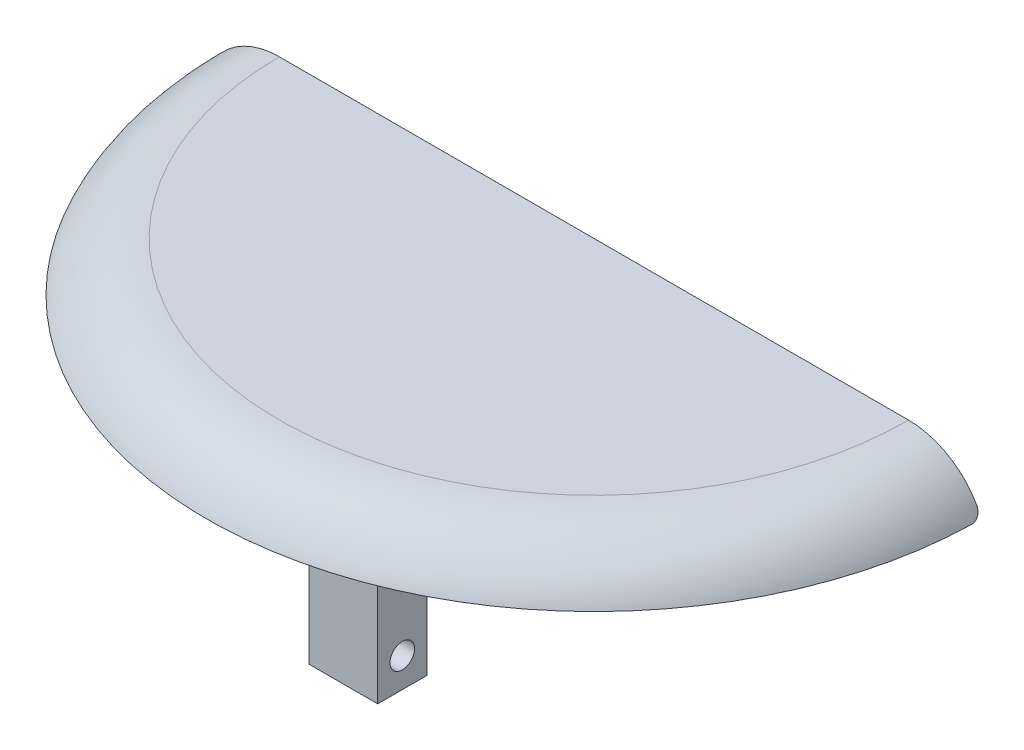
ISO-10303-21;
HEADER;
FILE_DESCRIPTION(('STEP AP214'),'2;1');
FILE_NAME('part.step','',(''),(''),'','','');
FILE_SCHEMA(('AUTOMOTIVE_DESIGN { 1 0 10303 214 1 1 1 1 }'));
ENDSEC;
DATA;
#1=APPLICATION_CONTEXT('core data for automotive mechanical design processes');
#2=APPLICATION_PROTOCOL_DEFINITION('international standard','automotive_design',2000,#1);
#3=PRODUCT_CONTEXT('',#1,'mechanical');
#4=PRODUCT('Part','Part','',(#3));
#5=PRODUCT_RELATED_PRODUCT_CATEGORY('part','',(#4));
#6=PRODUCT_DEFINITION_FORMATION('','',#4);
#7=PRODUCT_DEFINITION_CONTEXT('part definition',#1,'design');
#8=PRODUCT_DEFINITION('design','',#6,#7);
#9=PRODUCT_DEFINITION_SHAPE('','',#8);
#10=(LENGTH_UNIT() NAMED_UNIT(*) SI_UNIT(.MILLI.,.METRE.));
#11=(NAMED_UNIT(*) PLANE_ANGLE_UNIT() SI_UNIT($,.RADIAN.));
#12=(NAMED_UNIT(*) SI_UNIT($,.STERADIAN.) SOLID_ANGLE_UNIT());
#13=UNCERTAINTY_MEASURE_WITH_UNIT(LENGTH_MEASURE(1.E-05),#10,'distance_accuracy_value','');
#14=(GEOMETRIC_REPRESENTATION_CONTEXT(3) GLOBAL_UNCERTAINTY_ASSIGNED_CONTEXT((#13)) GLOBAL_UNIT_ASSIGNED_CONTEXT((#10,
#11,#12)) REPRESENTATION_CONTEXT('',''));
#15=CARTESIAN_POINT('',(0.,0.,0.));
#16=DIRECTION('',(0.,0.,1.));
#17=DIRECTION('',(1.,0.,0.));
#18=AXIS2_PLACEMENT_3D('',#15,#16,#17);
#19=CARTESIAN_POINT('',(0.,58.4278760968653,0.));
#20=DIRECTION('',(0.,1.,0.));
#21=DIRECTION('',(0.,0.,1.));
#22=AXIS2_PLACEMENT_3D('',#19,#20,#21);
#23=PLANE('',#22);
#24=DIRECTION('',(1.,0.,0.));
#25=VECTOR('',#24,1.);
#26=CARTESIAN_POINT('',(3.00000000000001,58.4278760968653,32.));
#27=LINE('',#26,#25);
#28=CARTESIAN_POINT('',(3.00000000000001,58.4278760968653,32.));
#29=VERTEX_POINT('',#28);
#30=CARTESIAN_POINT('',(10.,58.4278760968653,32.));
#31=VERTEX_POINT('',#30);
#32=EDGE_CURVE('E129',#29,#31,#27,.T.);
#33=ORIENTED_EDGE('',*,*,#32,.T.);
#34=DIRECTION('',(0.,0.,-1.));
#35=VECTOR('',#34,1.);
#36=CARTESIAN_POINT('',(10.,58.4278760968653,27.));
#37=LINE('',#36,#35);
#38=CARTESIAN_POINT('',(10.,58.4278760968653,27.));
#39=VERTEX_POINT('',#38);
#40=EDGE_CURVE('E142',#31,#39,#37,.T.);
#41=ORIENTED_EDGE('',*,*,#40,.T.);
#42=DIRECTION('',(-1.,0.,0.));
#43=VECTOR('',#42,1.);
#44=CARTESIAN_POINT('',(3.00000000000001,58.4278760968653,27.));
#45=LINE('',#44,#43);
#46=CARTESIAN_POINT('',(3.00000000000001,58.4278760968653,27.));
#47=VERTEX_POINT('',#46);
#48=EDGE_CURVE('E106',#39,#47,#45,.T.);
#49=ORIENTED_EDGE('',*,*,#48,.T.);
#50=DIRECTION('',(0.,0.,1.));
#51=VECTOR('',#50,1.);
#52=CARTESIAN_POINT('',(3.00000000000001,58.4278760968653,27.));
#53=LINE('',#52,#51);
#54=EDGE_CURVE('E133',#47,#29,#53,.T.);
#55=ORIENTED_EDGE('',*,*,#54,.T.);
#56=EDGE_LOOP('',(#33,#41,#49,#55));
#57=FACE_BOUND('',#56,.T.);
#58=CARTESIAN_POINT('',(0.,58.4278760968653,0.));
#59=DIRECTION('',(0.,1.,0.));
#60=DIRECTION('',(0.,0.,1.));
#61=AXIS2_PLACEMENT_3D('',#58,#59,#60);
#62=CIRCLE('',#61,39.4161984870957);
#63=CARTESIAN_POINT('',(39.4035113051378,58.4278760968653,0.999999999999999));
#64=VERTEX_POINT('',#63);
#65=CARTESIAN_POINT('',(-39.4035113051378,58.4278760968653,1.));
#66=VERTEX_POINT('',#65);
#67=EDGE_CURVE('E196',#64,#66,#62,.F.);
#68=ORIENTED_EDGE('',*,*,#67,.T.);
#69=DIRECTION('',(-1.,0.,0.));
#70=VECTOR('',#69,1.);
#71=CARTESIAN_POINT('',(0.,58.4278760968653,1.));
#72=LINE('',#71,#70);
#73=EDGE_CURVE('E12',#66,#64,#72,.F.);
#74=ORIENTED_EDGE('',*,*,#73,.T.);
#75=EDGE_LOOP('',(#68,#74));
#76=FACE_BOUND('',#75,.T.);
#77=ADVANCED_FACE('F42',(#57,#76),#23,.F.);
#78=CARTESIAN_POINT('',(0.,60.9278760968653,15.));
#79=DIRECTION('',(0.,0.,-1.));
#80=DIRECTION('',(-1.,0.,0.));
#81=AXIS2_PLACEMENT_3D('',#78,#79,#80);
#82=PLANE('',#81);
#83=CARTESIAN_POINT('',(0.,60.9278760968653,15.));
#84=DIRECTION('',(0.,0.,-1.));
#85=DIRECTION('',(-1.,0.,0.));
#86=AXIS2_PLACEMENT_3D('',#83,#84,#85);
#87=CIRCLE('',#86,1.);
#88=CARTESIAN_POINT('',(-1.,60.9278760968653,15.));
#89=VERTEX_POINT('',#88);
#90=EDGE_CURVE('E176',#89,#89,#87,.T.);
#91=ORIENTED_EDGE('',*,*,#90,.T.);
#92=EDGE_LOOP('',(#91));
#93=FACE_BOUND('',#92,.T.);
#94=ADVANCED_FACE('F231',(#93),#82,.T.);
#95=CARTESIAN_POINT('',(-30.4161984870957,60.9278760968653,15.));
#96=DIRECTION('',(0.,0.,-1.));
#97=DIRECTION('',(-1.,0.,0.));
#98=AXIS2_PLACEMENT_3D('',#95,#96,#97);
#99=PLANE('',#98);
#100=CARTESIAN_POINT('',(-30.4161984870957,60.9278760968653,15.));
#101=DIRECTION('',(0.,0.,-1.));
#102=DIRECTION('',(-1.,0.,0.));
#103=AXIS2_PLACEMENT_3D('',#100,#101,#102);
#104=CIRCLE('',#103,0.999999999999998);
#105=CARTESIAN_POINT('',(-31.4161984870957,60.9278760968653,15.));
#106=VERTEX_POINT('',#105);
#107=EDGE_CURVE('E168',#106,#106,#104,.T.);
#108=ORIENTED_EDGE('',*,*,#107,.T.);
#109=EDGE_LOOP('',(#108));
#110=FACE_BOUND('',#109,.T.);
#111=ADVANCED_FACE('F238',(#110),#99,.T.);
#112=CARTESIAN_POINT('',(30.4161984870957,60.9278760968653,15.));
#113=DIRECTION('',(0.,0.,-1.));
#114=DIRECTION('',(-1.,0.,0.));
#115=AXIS2_PLACEMENT_3D('',#112,#113,#114);
#116=PLANE('',#115);
#117=CARTESIAN_POINT('',(30.4161984870957,60.9278760968653,15.));
#118=DIRECTION('',(0.,0.,-1.));
#119=DIRECTION('',(-1.,0.,0.));
#120=AXIS2_PLACEMENT_3D('',#117,#118,#119);
#121=CIRCLE('',#120,1.);
#122=CARTESIAN_POINT('',(29.4161984870957,60.9278760968653,15.));
#123=VERTEX_POINT('',#122);
#124=EDGE_CURVE('E159',#123,#123,#121,.T.);
#125=ORIENTED_EDGE('',*,*,#124,.T.);
#126=EDGE_LOOP('',(#125));
#127=FACE_BOUND('',#126,.T.);
#128=ADVANCED_FACE('F228',(#127),#116,.T.);
#129=CARTESIAN_POINT('',(0.,63.4278760968653,0.));
#130=DIRECTION('',(0.,1.,0.));
#131=DIRECTION('',(0.,0.,1.));
#132=AXIS2_PLACEMENT_3D('',#129,#130,#131);
#133=PLANE('',#132);
#134=DIRECTION('',(1.,0.,0.));
#135=VECTOR('',#134,1.);
#136=CARTESIAN_POINT('',(0.,63.4278760968653,0.));
#137=LINE('',#136,#135);
#138=CARTESIAN_POINT('',(-32.,63.4278760968653,2.51386656396706E-13));
#139=VERTEX_POINT('',#138);
#140=CARTESIAN_POINT('',(32.,63.4278760968653,0.));
#141=VERTEX_POINT('',#140);
#142=EDGE_CURVE('E193',#139,#141,#137,.T.);
#143=ORIENTED_EDGE('',*,*,#142,.F.);
#144=CARTESIAN_POINT('',(0.,63.4278760968653,0.));
#145=DIRECTION('',(0.,-1.,0.));
#146=DIRECTION('',(0.,0.,-1.));
#147=AXIS2_PLACEMENT_3D('',#144,#145,#146);
#148=CIRCLE('',#147,32.);
#149=EDGE_CURVE('E189',#141,#139,#148,.T.);
#150=ORIENTED_EDGE('',*,*,#149,.F.);
#151=EDGE_LOOP('',(#143,#150));
#152=FACE_BOUND('',#151,.T.);
#153=ADVANCED_FACE('F223',(#152),#133,.T.);
#154=CARTESIAN_POINT('',(0.,55.4278760968653,0.));
#155=DIRECTION('',(0.,-1.,0.));
#156=DIRECTION('',(0.,0.,-1.));
#157=AXIS2_PLACEMENT_3D('',#154,#155,#156);
#158=TOROIDAL_SURFACE('',#157,32.,8.);
#159=CARTESIAN_POINT('',(-32.,55.4278760968653,1.1172740284298E-13));
#160=DIRECTION('',(0.,0.,1.));
#161=DIRECTION('',(1.,0.,0.));
#162=AXIS2_PLACEMENT_3D('',#159,#160,#161);
#163=CIRCLE('',#162,8.);
#164=CARTESIAN_POINT('',(-38.9282032302755,59.4278760968653,1.359170951332E-13));
#165=VERTEX_POINT('',#164);
#166=EDGE_CURVE('E186',#165,#139,#163,.F.);
#167=ORIENTED_EDGE('',*,*,#166,.F.);
#168=CARTESIAN_POINT('',(-38.9282032302755,59.4278760968653,0.));
#169=CARTESIAN_POINT('',(-38.9626021035287,59.3683581151527,-3.17048236836627E-05));
#170=CARTESIAN_POINT('',(-38.9962340636678,59.3082723680266,0.00531798358085913));
#171=CARTESIAN_POINT('',(-39.0612968632768,59.1885290354893,0.0271571008464615));
#172=CARTESIAN_POINT('',(-39.0927149168853,59.1288754803184,0.0437061785528483));
#173=CARTESIAN_POINT('',(-39.1524021685013,59.0120302331548,0.0884087723741813));
#174=CARTESIAN_POINT('',(-39.1806596390103,58.9548481636507,0.11660379703976));
#175=CARTESIAN_POINT('',(-39.2329834934601,58.8457032320536,0.18441081962347));
#176=CARTESIAN_POINT('',(-39.2570599904612,58.7937279084501,0.223994635332839));
#177=CARTESIAN_POINT('',(-39.2980442983298,58.7025297589063,0.309096562116425));
#178=CARTESIAN_POINT('',(-39.3154388107709,58.6625414441648,0.353558970440633));
#179=CARTESIAN_POINT('',(-39.3458391127704,58.5905998103798,0.449930194592522));
#180=CARTESIAN_POINT('',(-39.3588450774923,58.5586461706549,0.501838713099972));
#181=CARTESIAN_POINT('',(-39.3789942526035,58.5072986179241,0.605620590746932));
#182=CARTESIAN_POINT('',(-39.3866088664041,58.4869397080578,0.656928102552375));
#183=CARTESIAN_POINT('',(-39.3978795247534,58.4549157635044,0.762555422951551));
#184=CARTESIAN_POINT('',(-39.4015426585514,58.4432351710317,0.816869652529791));
#185=CARTESIAN_POINT('',(-39.4038573239905,58.4333803962425,0.893033255161506));
#186=CARTESIAN_POINT('',(-39.4042041769059,58.4313155276626,0.914393466162653));
#187=CARTESIAN_POINT('',(-39.4043021289989,58.4285650375151,0.957168034118493));
#188=CARTESIAN_POINT('',(-39.4040542240267,58.4278771139582,0.978582240674898));
#189=CARTESIAN_POINT('',(-39.4035113051378,58.4278760968653,1.));
#190=B_SPLINE_CURVE_WITH_KNOTS('',3,(#168,#169,#170,#171,#172,#173,#174,#175,#176,#177,#178,
#179,#180,#181,#182,#183,#184,#185,#186,#187,#188,#189),.UNSPECIFIED.,.F.,.F.,(4,2,2,2,2,2,2,2,
2,2,4),(0.,0.206184080947,0.413475048684915,0.62151130822178,0.829037133866088,1.01482828459576,
1.20061201882235,1.36693557851403,1.5329602425167,1.59730667196446,1.66154543631578),.UNSPECIFIED.);
#191=EDGE_CURVE('E52',#165,#66,#190,.T.);
#192=ORIENTED_EDGE('',*,*,#191,.T.);
#193=ORIENTED_EDGE('',*,*,#67,.F.);
#194=CARTESIAN_POINT('',(39.4035113051378,58.4278760968653,0.999999999999999));
#195=CARTESIAN_POINT('',(39.4041747014941,58.4278752737774,0.973846955871196));
#196=CARTESIAN_POINT('',(39.4043972477275,58.4289028365978,0.94769526000513));
#197=CARTESIAN_POINT('',(39.4039567084396,58.4330007972683,0.89556316845701));
#198=CARTESIAN_POINT('',(39.4032937313692,58.4360709449379,0.869582752189755));
#199=CARTESIAN_POINT('',(39.3999777610984,58.4482987139296,0.792306140445358));
#200=CARTESIAN_POINT('',(39.3960019878358,58.4604738731731,0.741505828150369));
#201=CARTESIAN_POINT('',(39.3845713611611,58.4924091608321,0.64279216435783));
#202=CARTESIAN_POINT('',(39.3771161063022,58.5121701644212,0.59487914670365));
#203=CARTESIAN_POINT('',(39.3588575144164,58.5585140885994,0.503160517804205));
#204=CARTESIAN_POINT('',(39.3480534154894,58.5850985613684,0.45935584421102));
#205=CARTESIAN_POINT('',(39.3230468158782,58.6447150552454,0.376030539357891));
#206=CARTESIAN_POINT('',(39.3087786843171,58.6778689925276,0.336617178781899));
#207=CARTESIAN_POINT('',(39.2772579152899,58.749077586112,0.263913452326962));
#208=CARTESIAN_POINT('',(39.2600051131391,58.7871325128059,0.230623424523458));
#209=CARTESIAN_POINT('',(39.2215485115199,58.8697382731035,0.168534448494099));
#210=CARTESIAN_POINT('',(39.2001528058787,58.9145572558606,0.140212253459962));
#211=CARTESIAN_POINT('',(39.1547586988788,59.0070772815275,0.0913352543510302));
#212=CARTESIAN_POINT('',(39.1307569342041,59.0547820127106,0.0707906449166165));
#213=CARTESIAN_POINT('',(39.0781926795937,59.1564924347534,0.0358860214786665));
#214=CARTESIAN_POINT('',(39.0494136995414,59.2106586363693,0.0223254593323006));
#215=CARTESIAN_POINT('',(38.9900303670043,59.3193284704951,0.00438361517163116));
#216=CARTESIAN_POINT('',(38.9594311056585,59.3738308120439,-2.21351311083883E-05));
#217=CARTESIAN_POINT('',(38.9282032302755,59.4278760968653,0.));
#218=B_SPLINE_CURVE_WITH_KNOTS('',3,(#194,#195,#196,#197,#198,#199,#200,#201,#202,#203,#204,
#205,#206,#207,#208,#209,#210,#211,#212,#213,#214,#215,#216,#217),.UNSPECIFIED.,.F.,.F.,(4,2,2,
2,2,2,2,2,2,2,2,4),(0.,0.0784355415039385,0.156861477809159,0.313213541485424,0.469583648814327,
0.625989358264571,0.785628077153142,0.945275607214232,1.11608549021736,1.28711849711743,
1.47484654534916,1.66207219948215),.UNSPECIFIED.);
#219=CARTESIAN_POINT('',(38.9282032302755,59.4278760968653,-1.359170951332E-13));
#220=VERTEX_POINT('',#219);
#221=EDGE_CURVE('E206',#64,#220,#218,.T.);
#222=ORIENTED_EDGE('',*,*,#221,.T.);
#223=CARTESIAN_POINT('',(32.,55.4278760968653,-1.1172740284298E-13));
#224=DIRECTION('',(0.,0.,1.));
#225=DIRECTION('',(1.,0.,0.));
#226=AXIS2_PLACEMENT_3D('',#223,#224,#225);
#227=CIRCLE('',#226,8.);
#228=EDGE_CURVE('E163',#141,#220,#227,.F.);
#229=ORIENTED_EDGE('',*,*,#228,.F.);
#230=ORIENTED_EDGE('',*,*,#149,.T.);
#231=EDGE_LOOP('',(#167,#192,#193,#222,#229,#230));
#232=FACE_BOUND('',#231,.T.);
#233=ADVANCED_FACE('F217',(#232),#158,.T.);
#234=CARTESIAN_POINT('',(0.,60.9278760968653,15.));
#235=DIRECTION('',(0.,0.,-1.));
#236=DIRECTION('',(-1.,0.,0.));
#237=AXIS2_PLACEMENT_3D('',#234,#235,#236);
#238=CYLINDRICAL_SURFACE('',#237,1.);
#239=ORIENTED_EDGE('',*,*,#90,.F.);
#240=EDGE_LOOP('',(#239));
#241=FACE_BOUND('',#240,.T.);
#242=CARTESIAN_POINT('',(0.,60.9278760968653,0.));
#243=DIRECTION('',(0.,0.,-1.));
#244=DIRECTION('',(-1.,0.,0.));
#245=AXIS2_PLACEMENT_3D('',#242,#243,#244);
#246=CIRCLE('',#245,1.);
#247=CARTESIAN_POINT('',(-1.,60.9278760968653,0.));
#248=VERTEX_POINT('',#247);
#249=EDGE_CURVE('E153',#248,#248,#246,.T.);
#250=ORIENTED_EDGE('',*,*,#249,.T.);
#251=EDGE_LOOP('',(#250));
#252=FACE_BOUND('',#251,.T.);
#253=ADVANCED_FACE('F222',(#241,#252),#238,.F.);
#254=CARTESIAN_POINT('',(-30.4161984870957,60.9278760968653,15.));
#255=DIRECTION('',(0.,0.,-1.));
#256=DIRECTION('',(-1.,0.,0.));
#257=AXIS2_PLACEMENT_3D('',#254,#255,#256);
#258=CYLINDRICAL_SURFACE('',#257,0.999999999999998);
#259=ORIENTED_EDGE('',*,*,#107,.F.);
#260=EDGE_LOOP('',(#259));
#261=FACE_BOUND('',#260,.T.);
#262=CARTESIAN_POINT('',(-30.4161984870957,60.9278760968653,0.));
#263=DIRECTION('',(0.,0.,-1.));
#264=DIRECTION('',(-1.,0.,0.));
#265=AXIS2_PLACEMENT_3D('',#262,#263,#264);
#266=CIRCLE('',#265,0.999999999999998);
#267=CARTESIAN_POINT('',(-31.4161984870957,60.9278760968653,0.));
#268=VERTEX_POINT('',#267);
#269=EDGE_CURVE('E172',#268,#268,#266,.T.);
#270=ORIENTED_EDGE('',*,*,#269,.T.);
#271=EDGE_LOOP('',(#270));
#272=FACE_BOUND('',#271,.T.);
#273=ADVANCED_FACE('F251',(#261,#272),#258,.F.);
#274=CARTESIAN_POINT('',(30.4161984870957,60.9278760968653,15.));
#275=DIRECTION('',(0.,0.,-1.));
#276=DIRECTION('',(-1.,0.,0.));
#277=AXIS2_PLACEMENT_3D('',#274,#275,#276);
#278=CYLINDRICAL_SURFACE('',#277,1.);
#279=ORIENTED_EDGE('',*,*,#124,.F.);
#280=EDGE_LOOP('',(#279));
#281=FACE_BOUND('',#280,.T.);
#282=CARTESIAN_POINT('',(30.4161984870957,60.9278760968653,0.));
#283=DIRECTION('',(0.,0.,-1.));
#284=DIRECTION('',(-1.,0.,0.));
#285=AXIS2_PLACEMENT_3D('',#282,#283,#284);
#286=CIRCLE('',#285,1.);
#287=CARTESIAN_POINT('',(29.4161984870957,60.9278760968653,0.));
#288=VERTEX_POINT('',#287);
#289=EDGE_CURVE('E164',#288,#288,#286,.T.);
#290=ORIENTED_EDGE('',*,*,#289,.T.);
#291=EDGE_LOOP('',(#290));
#292=FACE_BOUND('',#291,.T.);
#293=ADVANCED_FACE('F242',(#281,#292),#278,.F.);
#294=CARTESIAN_POINT('',(21.,73.,0.));
#295=DIRECTION('',(0.,0.,1.));
#296=DIRECTION('',(1.,0.,0.));
#297=AXIS2_PLACEMENT_3D('',#294,#295,#296);
#298=PLANE('',#297);
#299=ORIENTED_EDGE('',*,*,#289,.F.);
#300=EDGE_LOOP('',(#299));
#301=FACE_BOUND('',#300,.T.);
#302=ORIENTED_EDGE('',*,*,#269,.F.);
#303=EDGE_LOOP('',(#302));
#304=FACE_BOUND('',#303,.T.);
#305=ORIENTED_EDGE('',*,*,#249,.F.);
#306=EDGE_LOOP('',(#305));
#307=FACE_BOUND('',#306,.T.);
#308=ORIENTED_EDGE('',*,*,#228,.T.);
#309=DIRECTION('',(-1.,0.,0.));
#310=VECTOR('',#309,1.);
#311=CARTESIAN_POINT('',(21.,59.4278760968653,0.));
#312=LINE('',#311,#310);
#313=EDGE_CURVE('E199',#220,#165,#312,.T.);
#314=ORIENTED_EDGE('',*,*,#313,.T.);
#315=ORIENTED_EDGE('',*,*,#166,.T.);
#316=ORIENTED_EDGE('',*,*,#142,.T.);
#317=EDGE_LOOP('',(#308,#314,#315,#316));
#318=FACE_BOUND('',#317,.T.);
#319=ADVANCED_FACE('F224',(#301,#304,#307,#318),#298,.F.);
#320=CARTESIAN_POINT('',(10.,43.4278760968653,27.));
#321=DIRECTION('',(1.,0.,0.));
#322=DIRECTION('',(0.,0.,-1.));
#323=AXIS2_PLACEMENT_3D('',#320,#321,#322);
#324=PLANE('',#323);
#325=CARTESIAN_POINT('',(10.,46.4278760968653,29.5));
#326=DIRECTION('',(1.,0.,0.));
#327=DIRECTION('',(0.,0.,-1.));
#328=AXIS2_PLACEMENT_3D('',#325,#326,#327);
#329=CIRCLE('',#328,1.25);
#330=CARTESIAN_POINT('',(10.,46.4278760968653,28.25));
#331=VERTEX_POINT('',#330);
#332=EDGE_CURVE('E136',#331,#331,#329,.T.);
#333=ORIENTED_EDGE('',*,*,#332,.F.);
#334=EDGE_LOOP('',(#333));
#335=FACE_BOUND('',#334,.T.);
#336=ORIENTED_EDGE('',*,*,#40,.F.);
#337=DIRECTION('',(0.,1.,0.));
#338=VECTOR('',#337,1.);
#339=CARTESIAN_POINT('',(10.,43.4278760968653,32.));
#340=LINE('',#339,#338);
#341=CARTESIAN_POINT('',(10.,43.4278760968653,32.));
#342=VERTEX_POINT('',#341);
#343=EDGE_CURVE('E127',#342,#31,#340,.T.);
#344=ORIENTED_EDGE('',*,*,#343,.F.);
#345=DIRECTION('',(0.,0.,-1.));
#346=VECTOR('',#345,1.);
#347=CARTESIAN_POINT('',(10.,43.4278760968653,27.));
#348=LINE('',#347,#346);
#349=CARTESIAN_POINT('',(10.,43.4278760968653,27.));
#350=VERTEX_POINT('',#349);
#351=EDGE_CURVE('E120',#342,#350,#348,.T.);
#352=ORIENTED_EDGE('',*,*,#351,.T.);
#353=DIRECTION('',(0.,1.,0.));
#354=VECTOR('',#353,1.);
#355=CARTESIAN_POINT('',(10.,43.4278760968653,27.));
#356=LINE('',#355,#354);
#357=EDGE_CURVE('E100',#350,#39,#356,.T.);
#358=ORIENTED_EDGE('',*,*,#357,.T.);
#359=EDGE_LOOP('',(#336,#344,#352,#358));
#360=FACE_BOUND('',#359,.T.);
#361=ADVANCED_FACE('F126',(#335,#360),#324,.T.);
#362=CARTESIAN_POINT('',(3.00000000000001,43.4278760968653,32.));
#363=DIRECTION('',(0.,0.,1.));
#364=DIRECTION('',(1.,0.,0.));
#365=AXIS2_PLACEMENT_3D('',#362,#363,#364);
#366=PLANE('',#365);
#367=ORIENTED_EDGE('',*,*,#32,.F.);
#368=DIRECTION('',(0.,1.,0.));
#369=VECTOR('',#368,1.);
#370=CARTESIAN_POINT('',(3.00000000000001,43.4278760968653,32.));
#371=LINE('',#370,#369);
#372=CARTESIAN_POINT('',(3.00000000000001,43.4278760968653,32.));
#373=VERTEX_POINT('',#372);
#374=EDGE_CURVE('E154',#373,#29,#371,.T.);
#375=ORIENTED_EDGE('',*,*,#374,.F.);
#376=DIRECTION('',(1.,0.,0.));
#377=VECTOR('',#376,1.);
#378=CARTESIAN_POINT('',(3.00000000000001,43.4278760968653,32.));
#379=LINE('',#378,#377);
#380=EDGE_CURVE('E113',#373,#342,#379,.T.);
#381=ORIENTED_EDGE('',*,*,#380,.T.);
#382=ORIENTED_EDGE('',*,*,#343,.T.);
#383=EDGE_LOOP('',(#367,#375,#381,#382));
#384=FACE_BOUND('',#383,.T.);
#385=ADVANCED_FACE('F247',(#384),#366,.T.);
#386=CARTESIAN_POINT('',(3.00000000000001,43.4278760968653,27.));
#387=DIRECTION('',(-1.,0.,0.));
#388=DIRECTION('',(0.,0.,1.));
#389=AXIS2_PLACEMENT_3D('',#386,#387,#388);
#390=PLANE('',#389);
#391=CARTESIAN_POINT('',(3.00000000000001,46.4278760968653,29.5));
#392=DIRECTION('',(-1.,0.,0.));
#393=DIRECTION('',(0.,0.,1.));
#394=AXIS2_PLACEMENT_3D('',#391,#392,#393);
#395=CIRCLE('',#394,1.25);
#396=CARTESIAN_POINT('',(3.00000000000001,46.4278760968653,30.75));
#397=VERTEX_POINT('',#396);
#398=EDGE_CURVE('E145',#397,#397,#395,.T.);
#399=ORIENTED_EDGE('',*,*,#398,.F.);
#400=EDGE_LOOP('',(#399));
#401=FACE_BOUND('',#400,.T.);
#402=ORIENTED_EDGE('',*,*,#54,.F.);
#403=DIRECTION('',(0.,1.,0.));
#404=VECTOR('',#403,1.);
#405=CARTESIAN_POINT('',(3.00000000000001,43.4278760968653,27.));
#406=LINE('',#405,#404);
#407=CARTESIAN_POINT('',(3.00000000000001,43.4278760968653,27.));
#408=VERTEX_POINT('',#407);
#409=EDGE_CURVE('E112',#408,#47,#406,.T.);
#410=ORIENTED_EDGE('',*,*,#409,.F.);
#411=DIRECTION('',(0.,0.,1.));
#412=VECTOR('',#411,1.);
#413=CARTESIAN_POINT('',(3.00000000000001,43.4278760968653,27.));
#414=LINE('',#413,#412);
#415=EDGE_CURVE('E123',#408,#373,#414,.T.);
#416=ORIENTED_EDGE('',*,*,#415,.T.);
#417=ORIENTED_EDGE('',*,*,#374,.T.);
#418=EDGE_LOOP('',(#402,#410,#416,#417));
#419=FACE_BOUND('',#418,.T.);
#420=ADVANCED_FACE('F281',(#401,#419),#390,.T.);
#421=CARTESIAN_POINT('',(3.00000000000001,43.4278760968653,27.));
#422=DIRECTION('',(0.,0.,-1.));
#423=DIRECTION('',(-1.,0.,0.));
#424=AXIS2_PLACEMENT_3D('',#421,#422,#423);
#425=PLANE('',#424);
#426=ORIENTED_EDGE('',*,*,#48,.F.);
#427=ORIENTED_EDGE('',*,*,#357,.F.);
#428=DIRECTION('',(-1.,0.,0.));
#429=VECTOR('',#428,1.);
#430=CARTESIAN_POINT('',(3.00000000000001,43.4278760968653,27.));
#431=LINE('',#430,#429);
#432=EDGE_CURVE('E104',#350,#408,#431,.T.);
#433=ORIENTED_EDGE('',*,*,#432,.T.);
#434=ORIENTED_EDGE('',*,*,#409,.T.);
#435=EDGE_LOOP('',(#426,#427,#433,#434));
#436=FACE_BOUND('',#435,.T.);
#437=ADVANCED_FACE('F102',(#436),#425,.T.);
#438=CARTESIAN_POINT('',(0.,43.4278760968653,0.));
#439=DIRECTION('',(0.,1.,0.));
#440=DIRECTION('',(0.,0.,1.));
#441=AXIS2_PLACEMENT_3D('',#438,#439,#440);
#442=PLANE('',#441);
#443=ORIENTED_EDGE('',*,*,#351,.F.);
#444=ORIENTED_EDGE('',*,*,#380,.F.);
#445=ORIENTED_EDGE('',*,*,#415,.F.);
#446=ORIENTED_EDGE('',*,*,#432,.F.);
#447=EDGE_LOOP('',(#443,#444,#445,#446));
#448=FACE_BOUND('',#447,.T.);
#449=ADVANCED_FACE('F118',(#448),#442,.F.);
#450=CARTESIAN_POINT('',(2.5,46.4278760968653,29.5));
#451=DIRECTION('',(1.,0.,0.));
#452=DIRECTION('',(0.,0.,-1.));
#453=AXIS2_PLACEMENT_3D('',#450,#451,#452);
#454=CYLINDRICAL_SURFACE('',#453,1.25);
#455=ORIENTED_EDGE('',*,*,#398,.T.);
#456=EDGE_LOOP('',(#455));
#457=FACE_BOUND('',#456,.T.);
#458=ORIENTED_EDGE('',*,*,#332,.T.);
#459=EDGE_LOOP('',(#458));
#460=FACE_BOUND('',#459,.T.);
#461=ADVANCED_FACE('F268',(#457,#460),#454,.F.);
#462=CARTESIAN_POINT('',(21.,59.4278760968653,1.));
#463=DIRECTION('',(-1.,0.,0.));
#464=DIRECTION('',(0.,0.,1.));
#465=AXIS2_PLACEMENT_3D('',#462,#463,#464);
#466=CYLINDRICAL_SURFACE('',#465,1.);
#467=ORIENTED_EDGE('',*,*,#221,.F.);
#468=ORIENTED_EDGE('',*,*,#73,.F.);
#469=ORIENTED_EDGE('',*,*,#191,.F.);
#470=ORIENTED_EDGE('',*,*,#313,.F.);
#471=EDGE_LOOP('',(#467,#468,#469,#470));
#472=FACE_BOUND('',#471,.T.);
#473=ADVANCED_FACE('F44',(#472),#466,.T.);
#474=CLOSED_SHELL('',(#77,#94,#111,#128,#153,#233,#253,#273,#293,#319,#361,#385,#420,#437,#449,
#461,#473));
#475=MANIFOLD_SOLID_BREP('B2',#474);
#476=ADVANCED_BREP_SHAPE_REPRESENTATION('',(#18,#475),#14);
#477=SHAPE_DEFINITION_REPRESENTATION(#9,#476);
ENDSEC;
END-ISO-10303-21;
